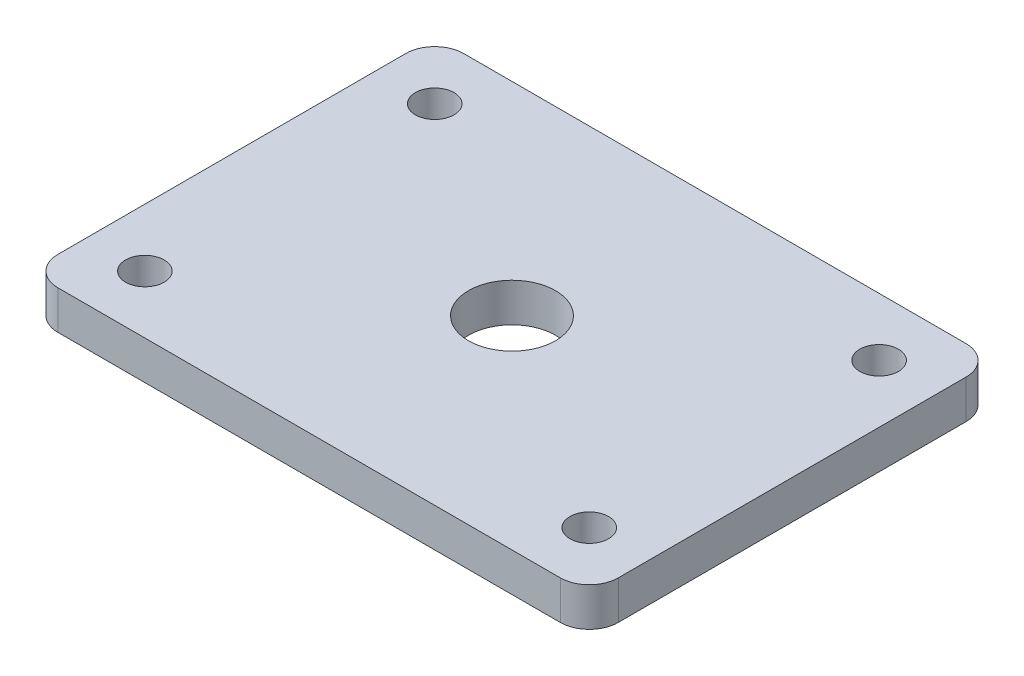
ISO-10303-21;
HEADER;
FILE_DESCRIPTION(('STEP AP214'),'2;1');
FILE_NAME('part.step','',(''),(''),'','','');
FILE_SCHEMA(('AUTOMOTIVE_DESIGN { 1 0 10303 214 1 1 1 1 }'));
ENDSEC;
DATA;
#1=APPLICATION_CONTEXT('core data for automotive mechanical design processes');
#2=APPLICATION_PROTOCOL_DEFINITION('international standard','automotive_design',2000,#1);
#3=PRODUCT_CONTEXT('',#1,'mechanical');
#4=PRODUCT('Part','Part','',(#3));
#5=PRODUCT_RELATED_PRODUCT_CATEGORY('part','',(#4));
#6=PRODUCT_DEFINITION_FORMATION('','',#4);
#7=PRODUCT_DEFINITION_CONTEXT('part definition',#1,'design');
#8=PRODUCT_DEFINITION('design','',#6,#7);
#9=PRODUCT_DEFINITION_SHAPE('','',#8);
#10=(LENGTH_UNIT() NAMED_UNIT(*) SI_UNIT(.MILLI.,.METRE.));
#11=(NAMED_UNIT(*) PLANE_ANGLE_UNIT() SI_UNIT($,.RADIAN.));
#12=(NAMED_UNIT(*) SI_UNIT($,.STERADIAN.) SOLID_ANGLE_UNIT());
#13=UNCERTAINTY_MEASURE_WITH_UNIT(LENGTH_MEASURE(1.E-05),#10,'distance_accuracy_value','');
#14=(GEOMETRIC_REPRESENTATION_CONTEXT(3) GLOBAL_UNCERTAINTY_ASSIGNED_CONTEXT((#13)) GLOBAL_UNIT_ASSIGNED_CONTEXT((#10,
#11,#12)) REPRESENTATION_CONTEXT('',''));
#15=CARTESIAN_POINT('',(0.,0.,0.));
#16=DIRECTION('',(0.,0.,1.));
#17=DIRECTION('',(1.,0.,0.));
#18=AXIS2_PLACEMENT_3D('',#15,#16,#17);
#19=CARTESIAN_POINT('',(29.,4.,0.));
#20=DIRECTION('',(1.,0.,0.));
#21=DIRECTION('',(0.,0.,-1.));
#22=AXIS2_PLACEMENT_3D('',#19,#20,#21);
#23=PLANE('',#22);
#24=DIRECTION('',(0.,0.,1.));
#25=VECTOR('',#24,1.);
#26=CARTESIAN_POINT('',(29.,4.,0.));
#27=LINE('',#26,#25);
#28=CARTESIAN_POINT('',(29.,4.,-18.));
#29=VERTEX_POINT('',#28);
#30=CARTESIAN_POINT('',(29.,4.,18.));
#31=VERTEX_POINT('',#30);
#32=EDGE_CURVE('E186',#29,#31,#27,.T.);
#33=ORIENTED_EDGE('',*,*,#32,.T.);
#34=DIRECTION('',(0.,-1.,0.));
#35=VECTOR('',#34,1.);
#36=CARTESIAN_POINT('',(29.,0.,18.));
#37=LINE('',#36,#35);
#38=CARTESIAN_POINT('',(29.,0.,18.));
#39=VERTEX_POINT('',#38);
#40=EDGE_CURVE('E122',#31,#39,#37,.T.);
#41=ORIENTED_EDGE('',*,*,#40,.T.);
#42=DIRECTION('',(0.,0.,1.));
#43=VECTOR('',#42,1.);
#44=CARTESIAN_POINT('',(29.,0.,0.));
#45=LINE('',#44,#43);
#46=CARTESIAN_POINT('',(29.,0.,-18.));
#47=VERTEX_POINT('',#46);
#48=EDGE_CURVE('E113',#47,#39,#45,.T.);
#49=ORIENTED_EDGE('',*,*,#48,.F.);
#50=DIRECTION('',(0.,-1.,0.));
#51=VECTOR('',#50,1.);
#52=CARTESIAN_POINT('',(29.,4.,-18.));
#53=LINE('',#52,#51);
#54=EDGE_CURVE('E127',#47,#29,#53,.F.);
#55=ORIENTED_EDGE('',*,*,#54,.T.);
#56=EDGE_LOOP('',(#33,#41,#49,#55));
#57=FACE_BOUND('',#56,.T.);
#58=ADVANCED_FACE('F42',(#57),#23,.T.);
#59=CARTESIAN_POINT('',(0.,4.,-21.));
#60=DIRECTION('',(0.,0.,-1.));
#61=DIRECTION('',(-1.,0.,0.));
#62=AXIS2_PLACEMENT_3D('',#59,#60,#61);
#63=PLANE('',#62);
#64=DIRECTION('',(1.,0.,0.));
#65=VECTOR('',#64,1.);
#66=CARTESIAN_POINT('',(0.,0.,-21.));
#67=LINE('',#66,#65);
#68=CARTESIAN_POINT('',(-26.,0.,-21.));
#69=VERTEX_POINT('',#68);
#70=CARTESIAN_POINT('',(26.,0.,-21.));
#71=VERTEX_POINT('',#70);
#72=EDGE_CURVE('E115',#69,#71,#67,.T.);
#73=ORIENTED_EDGE('',*,*,#72,.F.);
#74=DIRECTION('',(0.,-1.,0.));
#75=VECTOR('',#74,1.);
#76=CARTESIAN_POINT('',(-26.,4.,-21.));
#77=LINE('',#76,#75);
#78=CARTESIAN_POINT('',(-26.,4.,-21.));
#79=VERTEX_POINT('',#78);
#80=EDGE_CURVE('E11',#69,#79,#77,.F.);
#81=ORIENTED_EDGE('',*,*,#80,.T.);
#82=DIRECTION('',(1.,0.,0.));
#83=VECTOR('',#82,1.);
#84=CARTESIAN_POINT('',(0.,4.,-21.));
#85=LINE('',#84,#83);
#86=CARTESIAN_POINT('',(26.,4.,-21.));
#87=VERTEX_POINT('',#86);
#88=EDGE_CURVE('E183',#79,#87,#85,.T.);
#89=ORIENTED_EDGE('',*,*,#88,.T.);
#90=DIRECTION('',(0.,-1.,0.));
#91=VECTOR('',#90,1.);
#92=CARTESIAN_POINT('',(26.,4.,-21.));
#93=LINE('',#92,#91);
#94=EDGE_CURVE('E51',#87,#71,#93,.T.);
#95=ORIENTED_EDGE('',*,*,#94,.T.);
#96=EDGE_LOOP('',(#73,#81,#89,#95));
#97=FACE_BOUND('',#96,.T.);
#98=ADVANCED_FACE('F181',(#97),#63,.T.);
#99=CARTESIAN_POINT('',(-29.,4.,0.));
#100=DIRECTION('',(1.,0.,0.));
#101=DIRECTION('',(0.,0.,-1.));
#102=AXIS2_PLACEMENT_3D('',#99,#100,#101);
#103=PLANE('',#102);
#104=DIRECTION('',(0.,0.,1.));
#105=VECTOR('',#104,1.);
#106=CARTESIAN_POINT('',(-29.,0.,0.));
#107=LINE('',#106,#105);
#108=CARTESIAN_POINT('',(-29.,0.,-18.));
#109=VERTEX_POINT('',#108);
#110=CARTESIAN_POINT('',(-29.,0.,18.));
#111=VERTEX_POINT('',#110);
#112=EDGE_CURVE('E215',#109,#111,#107,.T.);
#113=ORIENTED_EDGE('',*,*,#112,.T.);
#114=DIRECTION('',(0.,-1.,0.));
#115=VECTOR('',#114,1.);
#116=CARTESIAN_POINT('',(-29.,4.,18.));
#117=LINE('',#116,#115);
#118=CARTESIAN_POINT('',(-29.,4.,18.));
#119=VERTEX_POINT('',#118);
#120=EDGE_CURVE('E58',#111,#119,#117,.F.);
#121=ORIENTED_EDGE('',*,*,#120,.T.);
#122=DIRECTION('',(0.,0.,1.));
#123=VECTOR('',#122,1.);
#124=CARTESIAN_POINT('',(-29.,4.,0.));
#125=LINE('',#124,#123);
#126=CARTESIAN_POINT('',(-29.,4.,-18.));
#127=VERTEX_POINT('',#126);
#128=EDGE_CURVE('E185',#127,#119,#125,.T.);
#129=ORIENTED_EDGE('',*,*,#128,.F.);
#130=DIRECTION('',(0.,-1.,0.));
#131=VECTOR('',#130,1.);
#132=CARTESIAN_POINT('',(-29.,0.,-18.));
#133=LINE('',#132,#131);
#134=EDGE_CURVE('E173',#127,#109,#133,.T.);
#135=ORIENTED_EDGE('',*,*,#134,.T.);
#136=EDGE_LOOP('',(#113,#121,#129,#135));
#137=FACE_BOUND('',#136,.T.);
#138=ADVANCED_FACE('F273',(#137),#103,.F.);
#139=CARTESIAN_POINT('',(0.,4.,21.));
#140=DIRECTION('',(0.,0.,-1.));
#141=DIRECTION('',(-1.,0.,0.));
#142=AXIS2_PLACEMENT_3D('',#139,#140,#141);
#143=PLANE('',#142);
#144=DIRECTION('',(1.,0.,0.));
#145=VECTOR('',#144,1.);
#146=CARTESIAN_POINT('',(0.,0.,21.));
#147=LINE('',#146,#145);
#148=CARTESIAN_POINT('',(-26.,0.,21.));
#149=VERTEX_POINT('',#148);
#150=CARTESIAN_POINT('',(26.,0.,21.));
#151=VERTEX_POINT('',#150);
#152=EDGE_CURVE('E217',#149,#151,#147,.T.);
#153=ORIENTED_EDGE('',*,*,#152,.T.);
#154=DIRECTION('',(0.,-1.,0.));
#155=VECTOR('',#154,1.);
#156=CARTESIAN_POINT('',(26.,4.,21.));
#157=LINE('',#156,#155);
#158=CARTESIAN_POINT('',(26.,4.,21.));
#159=VERTEX_POINT('',#158);
#160=EDGE_CURVE('E160',#151,#159,#157,.F.);
#161=ORIENTED_EDGE('',*,*,#160,.T.);
#162=DIRECTION('',(1.,0.,0.));
#163=VECTOR('',#162,1.);
#164=CARTESIAN_POINT('',(0.,4.,21.));
#165=LINE('',#164,#163);
#166=CARTESIAN_POINT('',(-26.,4.,21.));
#167=VERTEX_POINT('',#166);
#168=EDGE_CURVE('E142',#167,#159,#165,.T.);
#169=ORIENTED_EDGE('',*,*,#168,.F.);
#170=DIRECTION('',(0.,-1.,0.));
#171=VECTOR('',#170,1.);
#172=CARTESIAN_POINT('',(-26.,4.,21.));
#173=LINE('',#172,#171);
#174=EDGE_CURVE('E156',#167,#149,#173,.T.);
#175=ORIENTED_EDGE('',*,*,#174,.T.);
#176=EDGE_LOOP('',(#153,#161,#169,#175));
#177=FACE_BOUND('',#176,.T.);
#178=ADVANCED_FACE('F280',(#177),#143,.F.);
#179=CARTESIAN_POINT('',(-23.,4.,-15.));
#180=DIRECTION('',(0.,-1.,0.));
#181=DIRECTION('',(0.,0.,-1.));
#182=AXIS2_PLACEMENT_3D('',#179,#180,#181);
#183=CYLINDRICAL_SURFACE('',#182,2.);
#184=CARTESIAN_POINT('',(-23.,4.,-15.));
#185=DIRECTION('',(0.,1.,0.));
#186=DIRECTION('',(0.,0.,1.));
#187=AXIS2_PLACEMENT_3D('',#184,#185,#186);
#188=CIRCLE('',#187,2.);
#189=CARTESIAN_POINT('',(-23.,4.,-13.));
#190=VERTEX_POINT('',#189);
#191=EDGE_CURVE('E191',#190,#190,#188,.T.);
#192=ORIENTED_EDGE('',*,*,#191,.T.);
#193=EDGE_LOOP('',(#192));
#194=FACE_BOUND('',#193,.T.);
#195=CARTESIAN_POINT('',(-23.,0.,-15.));
#196=DIRECTION('',(0.,1.,0.));
#197=DIRECTION('',(0.,0.,1.));
#198=AXIS2_PLACEMENT_3D('',#195,#196,#197);
#199=CIRCLE('',#198,2.);
#200=CARTESIAN_POINT('',(-23.,0.,-13.));
#201=VERTEX_POINT('',#200);
#202=EDGE_CURVE('E131',#201,#201,#199,.T.);
#203=ORIENTED_EDGE('',*,*,#202,.F.);
#204=EDGE_LOOP('',(#203));
#205=FACE_BOUND('',#204,.T.);
#206=ADVANCED_FACE('F244',(#194,#205),#183,.F.);
#207=CARTESIAN_POINT('',(23.,4.,15.));
#208=DIRECTION('',(0.,-1.,0.));
#209=DIRECTION('',(0.,0.,-1.));
#210=AXIS2_PLACEMENT_3D('',#207,#208,#209);
#211=CYLINDRICAL_SURFACE('',#210,2.);
#212=CARTESIAN_POINT('',(23.,4.,15.));
#213=DIRECTION('',(0.,1.,0.));
#214=DIRECTION('',(0.,0.,1.));
#215=AXIS2_PLACEMENT_3D('',#212,#213,#214);
#216=CIRCLE('',#215,2.);
#217=CARTESIAN_POINT('',(23.,4.,17.));
#218=VERTEX_POINT('',#217);
#219=EDGE_CURVE('E235',#218,#218,#216,.T.);
#220=ORIENTED_EDGE('',*,*,#219,.T.);
#221=EDGE_LOOP('',(#220));
#222=FACE_BOUND('',#221,.T.);
#223=CARTESIAN_POINT('',(23.,0.,15.));
#224=DIRECTION('',(0.,1.,0.));
#225=DIRECTION('',(0.,0.,1.));
#226=AXIS2_PLACEMENT_3D('',#223,#224,#225);
#227=CIRCLE('',#226,2.);
#228=CARTESIAN_POINT('',(23.,0.,17.));
#229=VERTEX_POINT('',#228);
#230=EDGE_CURVE('E206',#229,#229,#227,.T.);
#231=ORIENTED_EDGE('',*,*,#230,.F.);
#232=EDGE_LOOP('',(#231));
#233=FACE_BOUND('',#232,.T.);
#234=ADVANCED_FACE('F279',(#222,#233),#211,.F.);
#235=CARTESIAN_POINT('',(23.,4.,-15.));
#236=DIRECTION('',(0.,-1.,0.));
#237=DIRECTION('',(0.,0.,-1.));
#238=AXIS2_PLACEMENT_3D('',#235,#236,#237);
#239=CYLINDRICAL_SURFACE('',#238,2.);
#240=CARTESIAN_POINT('',(23.,4.,-15.));
#241=DIRECTION('',(0.,1.,0.));
#242=DIRECTION('',(0.,0.,1.));
#243=AXIS2_PLACEMENT_3D('',#240,#241,#242);
#244=CIRCLE('',#243,2.);
#245=CARTESIAN_POINT('',(23.,4.,-13.));
#246=VERTEX_POINT('',#245);
#247=EDGE_CURVE('E229',#246,#246,#244,.T.);
#248=ORIENTED_EDGE('',*,*,#247,.T.);
#249=EDGE_LOOP('',(#248));
#250=FACE_BOUND('',#249,.T.);
#251=CARTESIAN_POINT('',(23.,0.,-15.));
#252=DIRECTION('',(0.,1.,0.));
#253=DIRECTION('',(0.,0.,1.));
#254=AXIS2_PLACEMENT_3D('',#251,#252,#253);
#255=CIRCLE('',#254,2.);
#256=CARTESIAN_POINT('',(23.,0.,-13.));
#257=VERTEX_POINT('',#256);
#258=EDGE_CURVE('E202',#257,#257,#255,.T.);
#259=ORIENTED_EDGE('',*,*,#258,.F.);
#260=EDGE_LOOP('',(#259));
#261=FACE_BOUND('',#260,.T.);
#262=ADVANCED_FACE('F264',(#250,#261),#239,.F.);
#263=CARTESIAN_POINT('',(-23.,4.,15.));
#264=DIRECTION('',(0.,-1.,0.));
#265=DIRECTION('',(0.,0.,-1.));
#266=AXIS2_PLACEMENT_3D('',#263,#264,#265);
#267=CYLINDRICAL_SURFACE('',#266,2.);
#268=CARTESIAN_POINT('',(-23.,4.,15.));
#269=DIRECTION('',(0.,1.,0.));
#270=DIRECTION('',(0.,0.,1.));
#271=AXIS2_PLACEMENT_3D('',#268,#269,#270);
#272=CIRCLE('',#271,2.);
#273=CARTESIAN_POINT('',(-23.,4.,17.));
#274=VERTEX_POINT('',#273);
#275=EDGE_CURVE('E225',#274,#274,#272,.T.);
#276=ORIENTED_EDGE('',*,*,#275,.T.);
#277=EDGE_LOOP('',(#276));
#278=FACE_BOUND('',#277,.T.);
#279=CARTESIAN_POINT('',(-23.,0.,15.));
#280=DIRECTION('',(0.,1.,0.));
#281=DIRECTION('',(0.,0.,1.));
#282=AXIS2_PLACEMENT_3D('',#279,#280,#281);
#283=CIRCLE('',#282,2.);
#284=CARTESIAN_POINT('',(-23.,0.,17.));
#285=VERTEX_POINT('',#284);
#286=EDGE_CURVE('E198',#285,#285,#283,.T.);
#287=ORIENTED_EDGE('',*,*,#286,.F.);
#288=EDGE_LOOP('',(#287));
#289=FACE_BOUND('',#288,.T.);
#290=ADVANCED_FACE('F259',(#278,#289),#267,.F.);
#291=CARTESIAN_POINT('',(0.,4.,0.));
#292=DIRECTION('',(0.,-1.,0.));
#293=DIRECTION('',(0.,0.,-1.));
#294=AXIS2_PLACEMENT_3D('',#291,#292,#293);
#295=CYLINDRICAL_SURFACE('',#294,4.5);
#296=CARTESIAN_POINT('',(0.,4.,0.));
#297=DIRECTION('',(0.,1.,0.));
#298=DIRECTION('',(0.,0.,1.));
#299=AXIS2_PLACEMENT_3D('',#296,#297,#298);
#300=CIRCLE('',#299,4.5);
#301=CARTESIAN_POINT('',(0.,4.,4.50000000000001));
#302=VERTEX_POINT('',#301);
#303=EDGE_CURVE('E136',#302,#302,#300,.T.);
#304=ORIENTED_EDGE('',*,*,#303,.T.);
#305=EDGE_LOOP('',(#304));
#306=FACE_BOUND('',#305,.T.);
#307=CARTESIAN_POINT('',(0.,0.,0.));
#308=DIRECTION('',(0.,1.,0.));
#309=DIRECTION('',(0.,0.,1.));
#310=AXIS2_PLACEMENT_3D('',#307,#308,#309);
#311=CIRCLE('',#310,4.5);
#312=CARTESIAN_POINT('',(0.,0.,4.50000000000001));
#313=VERTEX_POINT('',#312);
#314=EDGE_CURVE('E145',#313,#313,#311,.T.);
#315=ORIENTED_EDGE('',*,*,#314,.F.);
#316=EDGE_LOOP('',(#315));
#317=FACE_BOUND('',#316,.T.);
#318=ADVANCED_FACE('F249',(#306,#317),#295,.F.);
#319=CARTESIAN_POINT('',(0.,4.,0.));
#320=DIRECTION('',(0.,1.,0.));
#321=DIRECTION('',(0.,0.,1.));
#322=AXIS2_PLACEMENT_3D('',#319,#320,#321);
#323=PLANE('',#322);
#324=ORIENTED_EDGE('',*,*,#275,.F.);
#325=EDGE_LOOP('',(#324));
#326=FACE_BOUND('',#325,.T.);
#327=ORIENTED_EDGE('',*,*,#247,.F.);
#328=EDGE_LOOP('',(#327));
#329=FACE_BOUND('',#328,.T.);
#330=ORIENTED_EDGE('',*,*,#219,.F.);
#331=EDGE_LOOP('',(#330));
#332=FACE_BOUND('',#331,.T.);
#333=ORIENTED_EDGE('',*,*,#191,.F.);
#334=EDGE_LOOP('',(#333));
#335=FACE_BOUND('',#334,.T.);
#336=ORIENTED_EDGE('',*,*,#168,.T.);
#337=CARTESIAN_POINT('',(26.,4.,18.));
#338=DIRECTION('',(0.,1.,0.));
#339=DIRECTION('',(0.,0.,1.));
#340=AXIS2_PLACEMENT_3D('',#337,#338,#339);
#341=CIRCLE('',#340,3.);
#342=EDGE_CURVE('E170',#159,#31,#341,.T.);
#343=ORIENTED_EDGE('',*,*,#342,.T.);
#344=ORIENTED_EDGE('',*,*,#32,.F.);
#345=CARTESIAN_POINT('',(26.,4.,-18.));
#346=DIRECTION('',(0.,1.,0.));
#347=DIRECTION('',(0.,0.,1.));
#348=AXIS2_PLACEMENT_3D('',#345,#346,#347);
#349=CIRCLE('',#348,3.);
#350=EDGE_CURVE('E134',#29,#87,#349,.T.);
#351=ORIENTED_EDGE('',*,*,#350,.T.);
#352=ORIENTED_EDGE('',*,*,#88,.F.);
#353=CARTESIAN_POINT('',(-26.,4.,-18.));
#354=DIRECTION('',(0.,1.,0.));
#355=DIRECTION('',(0.,0.,1.));
#356=AXIS2_PLACEMENT_3D('',#353,#354,#355);
#357=CIRCLE('',#356,3.);
#358=EDGE_CURVE('E65',#79,#127,#357,.T.);
#359=ORIENTED_EDGE('',*,*,#358,.T.);
#360=ORIENTED_EDGE('',*,*,#128,.T.);
#361=CARTESIAN_POINT('',(-26.,4.,18.));
#362=DIRECTION('',(0.,1.,0.));
#363=DIRECTION('',(0.,0.,1.));
#364=AXIS2_PLACEMENT_3D('',#361,#362,#363);
#365=CIRCLE('',#364,3.);
#366=EDGE_CURVE('E167',#119,#167,#365,.T.);
#367=ORIENTED_EDGE('',*,*,#366,.T.);
#368=EDGE_LOOP('',(#336,#343,#344,#351,#352,#359,#360,#367));
#369=FACE_BOUND('',#368,.T.);
#370=ORIENTED_EDGE('',*,*,#303,.F.);
#371=EDGE_LOOP('',(#370));
#372=FACE_BOUND('',#371,.T.);
#373=ADVANCED_FACE('F247',(#326,#329,#332,#335,#369,#372),#323,.T.);
#374=CARTESIAN_POINT('',(0.,0.,0.));
#375=DIRECTION('',(0.,1.,0.));
#376=DIRECTION('',(0.,0.,1.));
#377=AXIS2_PLACEMENT_3D('',#374,#375,#376);
#378=PLANE('',#377);
#379=ORIENTED_EDGE('',*,*,#286,.T.);
#380=EDGE_LOOP('',(#379));
#381=FACE_BOUND('',#380,.T.);
#382=ORIENTED_EDGE('',*,*,#258,.T.);
#383=EDGE_LOOP('',(#382));
#384=FACE_BOUND('',#383,.T.);
#385=ORIENTED_EDGE('',*,*,#230,.T.);
#386=EDGE_LOOP('',(#385));
#387=FACE_BOUND('',#386,.T.);
#388=ORIENTED_EDGE('',*,*,#202,.T.);
#389=EDGE_LOOP('',(#388));
#390=FACE_BOUND('',#389,.T.);
#391=ORIENTED_EDGE('',*,*,#48,.T.);
#392=CARTESIAN_POINT('',(26.,0.,18.));
#393=DIRECTION('',(0.,1.,0.));
#394=DIRECTION('',(0.,0.,1.));
#395=AXIS2_PLACEMENT_3D('',#392,#393,#394);
#396=CIRCLE('',#395,3.);
#397=EDGE_CURVE('E153',#39,#151,#396,.F.);
#398=ORIENTED_EDGE('',*,*,#397,.T.);
#399=ORIENTED_EDGE('',*,*,#152,.F.);
#400=CARTESIAN_POINT('',(-26.,0.,18.));
#401=DIRECTION('',(0.,1.,0.));
#402=DIRECTION('',(0.,0.,1.));
#403=AXIS2_PLACEMENT_3D('',#400,#401,#402);
#404=CIRCLE('',#403,3.);
#405=EDGE_CURVE('E150',#149,#111,#404,.F.);
#406=ORIENTED_EDGE('',*,*,#405,.T.);
#407=ORIENTED_EDGE('',*,*,#112,.F.);
#408=CARTESIAN_POINT('',(-26.,0.,-18.));
#409=DIRECTION('',(0.,1.,0.));
#410=DIRECTION('',(0.,0.,1.));
#411=AXIS2_PLACEMENT_3D('',#408,#409,#410);
#412=CIRCLE('',#411,3.);
#413=EDGE_CURVE('E121',#109,#69,#412,.F.);
#414=ORIENTED_EDGE('',*,*,#413,.T.);
#415=ORIENTED_EDGE('',*,*,#72,.T.);
#416=CARTESIAN_POINT('',(26.,0.,-18.));
#417=DIRECTION('',(0.,1.,0.));
#418=DIRECTION('',(0.,0.,1.));
#419=AXIS2_PLACEMENT_3D('',#416,#417,#418);
#420=CIRCLE('',#419,3.);
#421=EDGE_CURVE('E109',#71,#47,#420,.F.);
#422=ORIENTED_EDGE('',*,*,#421,.T.);
#423=EDGE_LOOP('',(#391,#398,#399,#406,#407,#414,#415,#422));
#424=FACE_BOUND('',#423,.T.);
#425=ORIENTED_EDGE('',*,*,#314,.T.);
#426=EDGE_LOOP('',(#425));
#427=FACE_BOUND('',#426,.T.);
#428=ADVANCED_FACE('F111',(#381,#384,#387,#390,#424,#427),#378,.F.);
#429=CARTESIAN_POINT('',(26.,4.,18.));
#430=DIRECTION('',(0.,1.,0.));
#431=DIRECTION('',(0.,0.,1.));
#432=AXIS2_PLACEMENT_3D('',#429,#430,#431);
#433=CYLINDRICAL_SURFACE('',#432,3.);
#434=ORIENTED_EDGE('',*,*,#342,.F.);
#435=ORIENTED_EDGE('',*,*,#160,.F.);
#436=ORIENTED_EDGE('',*,*,#397,.F.);
#437=ORIENTED_EDGE('',*,*,#40,.F.);
#438=EDGE_LOOP('',(#434,#435,#436,#437));
#439=FACE_BOUND('',#438,.T.);
#440=ADVANCED_FACE('F287',(#439),#433,.T.);
#441=CARTESIAN_POINT('',(-26.,4.,18.));
#442=DIRECTION('',(0.,-1.,0.));
#443=DIRECTION('',(0.,0.,-1.));
#444=AXIS2_PLACEMENT_3D('',#441,#442,#443);
#445=CYLINDRICAL_SURFACE('',#444,3.);
#446=ORIENTED_EDGE('',*,*,#366,.F.);
#447=ORIENTED_EDGE('',*,*,#120,.F.);
#448=ORIENTED_EDGE('',*,*,#405,.F.);
#449=ORIENTED_EDGE('',*,*,#174,.F.);
#450=EDGE_LOOP('',(#446,#447,#448,#449));
#451=FACE_BOUND('',#450,.T.);
#452=ADVANCED_FACE('F290',(#451),#445,.T.);
#453=CARTESIAN_POINT('',(-26.,4.,-18.));
#454=DIRECTION('',(0.,1.,0.));
#455=DIRECTION('',(0.,0.,1.));
#456=AXIS2_PLACEMENT_3D('',#453,#454,#455);
#457=CYLINDRICAL_SURFACE('',#456,3.);
#458=ORIENTED_EDGE('',*,*,#358,.F.);
#459=ORIENTED_EDGE('',*,*,#80,.F.);
#460=ORIENTED_EDGE('',*,*,#413,.F.);
#461=ORIENTED_EDGE('',*,*,#134,.F.);
#462=EDGE_LOOP('',(#458,#459,#460,#461));
#463=FACE_BOUND('',#462,.T.);
#464=ADVANCED_FACE('F293',(#463),#457,.T.);
#465=CARTESIAN_POINT('',(26.,4.,-18.));
#466=DIRECTION('',(0.,-1.,0.));
#467=DIRECTION('',(0.,0.,-1.));
#468=AXIS2_PLACEMENT_3D('',#465,#466,#467);
#469=CYLINDRICAL_SURFACE('',#468,3.);
#470=ORIENTED_EDGE('',*,*,#350,.F.);
#471=ORIENTED_EDGE('',*,*,#54,.F.);
#472=ORIENTED_EDGE('',*,*,#421,.F.);
#473=ORIENTED_EDGE('',*,*,#94,.F.);
#474=EDGE_LOOP('',(#470,#471,#472,#473));
#475=FACE_BOUND('',#474,.T.);
#476=ADVANCED_FACE('F44',(#475),#469,.T.);
#477=CLOSED_SHELL('',(#58,#98,#138,#178,#206,#234,#262,#290,#318,#373,#428,#440,#452,#464,#476));
#478=MANIFOLD_SOLID_BREP('B2',#477);
#479=ADVANCED_BREP_SHAPE_REPRESENTATION('',(#18,#478),#14);
#480=SHAPE_DEFINITION_REPRESENTATION(#9,#479);
ENDSEC;
END-ISO-10303-21;
